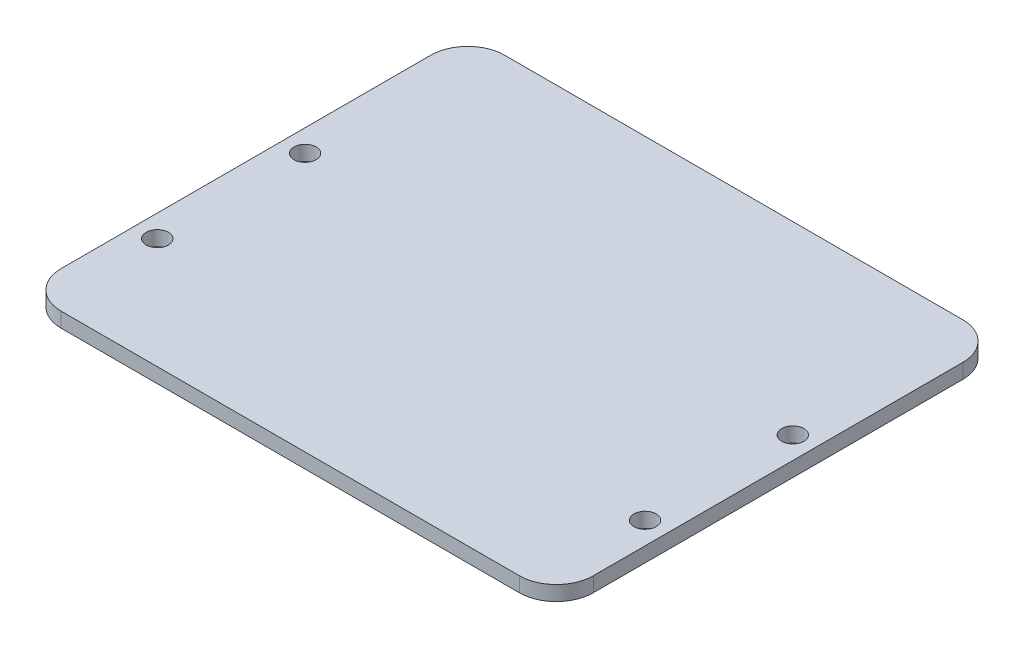
ISO-10303-21;
HEADER;
FILE_DESCRIPTION(('STEP AP214'),'2;1');
FILE_NAME('part.step','',(''),(''),'','','');
FILE_SCHEMA(('AUTOMOTIVE_DESIGN { 1 0 10303 214 1 1 1 1 }'));
ENDSEC;
DATA;
#1=APPLICATION_CONTEXT('core data for automotive mechanical design processes');
#2=APPLICATION_PROTOCOL_DEFINITION('international standard','automotive_design',2000,#1);
#3=PRODUCT_CONTEXT('',#1,'mechanical');
#4=PRODUCT('Part','Part','',(#3));
#5=PRODUCT_RELATED_PRODUCT_CATEGORY('part','',(#4));
#6=PRODUCT_DEFINITION_FORMATION('','',#4);
#7=PRODUCT_DEFINITION_CONTEXT('part definition',#1,'design');
#8=PRODUCT_DEFINITION('design','',#6,#7);
#9=PRODUCT_DEFINITION_SHAPE('','',#8);
#10=(LENGTH_UNIT() NAMED_UNIT(*) SI_UNIT(.MILLI.,.METRE.));
#11=(NAMED_UNIT(*) PLANE_ANGLE_UNIT() SI_UNIT($,.RADIAN.));
#12=(NAMED_UNIT(*) SI_UNIT($,.STERADIAN.) SOLID_ANGLE_UNIT());
#13=UNCERTAINTY_MEASURE_WITH_UNIT(LENGTH_MEASURE(1.E-05),#10,'distance_accuracy_value','');
#14=(GEOMETRIC_REPRESENTATION_CONTEXT(3) GLOBAL_UNCERTAINTY_ASSIGNED_CONTEXT((#13)) GLOBAL_UNIT_ASSIGNED_CONTEXT((#10,
#11,#12)) REPRESENTATION_CONTEXT('',''));
#15=CARTESIAN_POINT('',(0.,0.,0.));
#16=DIRECTION('',(0.,0.,1.));
#17=DIRECTION('',(1.,0.,0.));
#18=AXIS2_PLACEMENT_3D('',#15,#16,#17);
#19=CARTESIAN_POINT('',(0.,2.,0.));
#20=DIRECTION('',(0.,1.,0.));
#21=DIRECTION('',(0.,0.,1.));
#22=AXIS2_PLACEMENT_3D('',#19,#20,#21);
#23=PLANE('',#22);
#24=CARTESIAN_POINT('',(33.,2.,15.));
#25=DIRECTION('',(0.,1.,0.));
#26=DIRECTION('',(0.,0.,-1.));
#27=AXIS2_PLACEMENT_3D('',#24,#25,#26);
#28=CIRCLE('',#27,1.5);
#29=CARTESIAN_POINT('',(33.,2.,13.5));
#30=VERTEX_POINT('',#29);
#31=EDGE_CURVE('E193',#30,#30,#28,.T.);
#32=ORIENTED_EDGE('',*,*,#31,.F.);
#33=EDGE_LOOP('',(#32));
#34=FACE_BOUND('',#33,.T.);
#35=CARTESIAN_POINT('',(-33.,2.,-5.));
#36=DIRECTION('',(0.,1.,0.));
#37=DIRECTION('',(0.,0.,1.));
#38=AXIS2_PLACEMENT_3D('',#35,#36,#37);
#39=CIRCLE('',#38,1.5);
#40=CARTESIAN_POINT('',(-33.,2.,-3.5));
#41=VERTEX_POINT('',#40);
#42=EDGE_CURVE('E136',#41,#41,#39,.T.);
#43=ORIENTED_EDGE('',*,*,#42,.F.);
#44=EDGE_LOOP('',(#43));
#45=FACE_BOUND('',#44,.T.);
#46=DIRECTION('',(1.,0.,0.));
#47=VECTOR('',#46,1.);
#48=CARTESIAN_POINT('',(-36.,2.,30.));
#49=LINE('',#48,#47);
#50=CARTESIAN_POINT('',(-31.,2.,30.));
#51=VERTEX_POINT('',#50);
#52=CARTESIAN_POINT('',(31.,2.,30.));
#53=VERTEX_POINT('',#52);
#54=EDGE_CURVE('E144',#51,#53,#49,.T.);
#55=ORIENTED_EDGE('',*,*,#54,.T.);
#56=CARTESIAN_POINT('',(31.,2.,25.));
#57=DIRECTION('',(0.,1.,0.));
#58=DIRECTION('',(0.,0.,1.));
#59=AXIS2_PLACEMENT_3D('',#56,#57,#58);
#60=CIRCLE('',#59,5.);
#61=CARTESIAN_POINT('',(36.,2.,25.));
#62=VERTEX_POINT('',#61);
#63=EDGE_CURVE('E162',#53,#62,#60,.T.);
#64=ORIENTED_EDGE('',*,*,#63,.T.);
#65=DIRECTION('',(0.,0.,-1.));
#66=VECTOR('',#65,1.);
#67=CARTESIAN_POINT('',(36.,2.,-30.));
#68=LINE('',#67,#66);
#69=CARTESIAN_POINT('',(36.,2.,-25.));
#70=VERTEX_POINT('',#69);
#71=EDGE_CURVE('E130',#62,#70,#68,.T.);
#72=ORIENTED_EDGE('',*,*,#71,.T.);
#73=CARTESIAN_POINT('',(31.,2.,-25.));
#74=DIRECTION('',(0.,1.,0.));
#75=DIRECTION('',(0.,0.,1.));
#76=AXIS2_PLACEMENT_3D('',#73,#74,#75);
#77=CIRCLE('',#76,5.);
#78=CARTESIAN_POINT('',(31.,2.,-30.));
#79=VERTEX_POINT('',#78);
#80=EDGE_CURVE('E159',#70,#79,#77,.T.);
#81=ORIENTED_EDGE('',*,*,#80,.T.);
#82=DIRECTION('',(-1.,0.,0.));
#83=VECTOR('',#82,1.);
#84=CARTESIAN_POINT('',(-36.,2.,-30.));
#85=LINE('',#84,#83);
#86=CARTESIAN_POINT('',(-31.,2.,-30.));
#87=VERTEX_POINT('',#86);
#88=EDGE_CURVE('E173',#79,#87,#85,.T.);
#89=ORIENTED_EDGE('',*,*,#88,.T.);
#90=CARTESIAN_POINT('',(-31.,2.,-25.));
#91=DIRECTION('',(0.,1.,0.));
#92=DIRECTION('',(0.,0.,1.));
#93=AXIS2_PLACEMENT_3D('',#90,#91,#92);
#94=CIRCLE('',#93,5.);
#95=CARTESIAN_POINT('',(-36.,2.,-25.));
#96=VERTEX_POINT('',#95);
#97=EDGE_CURVE('E64',#87,#96,#94,.T.);
#98=ORIENTED_EDGE('',*,*,#97,.T.);
#99=DIRECTION('',(0.,0.,1.));
#100=VECTOR('',#99,1.);
#101=CARTESIAN_POINT('',(-36.,2.,-30.));
#102=LINE('',#101,#100);
#103=CARTESIAN_POINT('',(-36.,2.,25.));
#104=VERTEX_POINT('',#103);
#105=EDGE_CURVE('E185',#96,#104,#102,.T.);
#106=ORIENTED_EDGE('',*,*,#105,.T.);
#107=CARTESIAN_POINT('',(-31.,2.,25.));
#108=DIRECTION('',(0.,1.,0.));
#109=DIRECTION('',(0.,0.,1.));
#110=AXIS2_PLACEMENT_3D('',#107,#108,#109);
#111=CIRCLE('',#110,5.);
#112=EDGE_CURVE('E158',#104,#51,#111,.T.);
#113=ORIENTED_EDGE('',*,*,#112,.T.);
#114=EDGE_LOOP('',(#55,#64,#72,#81,#89,#98,#106,#113));
#115=FACE_BOUND('',#114,.T.);
#116=CARTESIAN_POINT('',(-33.,2.,15.));
#117=DIRECTION('',(0.,1.,0.));
#118=DIRECTION('',(0.,0.,1.));
#119=AXIS2_PLACEMENT_3D('',#116,#117,#118);
#120=CIRCLE('',#119,1.5);
#121=CARTESIAN_POINT('',(-33.,2.,16.5));
#122=VERTEX_POINT('',#121);
#123=EDGE_CURVE('E188',#122,#122,#120,.T.);
#124=ORIENTED_EDGE('',*,*,#123,.F.);
#125=EDGE_LOOP('',(#124));
#126=FACE_BOUND('',#125,.T.);
#127=CARTESIAN_POINT('',(33.,2.,-5.00000000000001));
#128=DIRECTION('',(0.,1.,0.));
#129=DIRECTION('',(0.,0.,-1.));
#130=AXIS2_PLACEMENT_3D('',#127,#128,#129);
#131=CIRCLE('',#130,1.5);
#132=CARTESIAN_POINT('',(33.,2.,-6.50000000000001));
#133=VERTEX_POINT('',#132);
#134=EDGE_CURVE('E199',#133,#133,#131,.T.);
#135=ORIENTED_EDGE('',*,*,#134,.F.);
#136=EDGE_LOOP('',(#135));
#137=FACE_BOUND('',#136,.T.);
#138=ADVANCED_FACE('F41',(#34,#45,#115,#126,#137),#23,.T.);
#139=CARTESIAN_POINT('',(0.,0.,0.));
#140=DIRECTION('',(0.,1.,0.));
#141=DIRECTION('',(0.,0.,1.));
#142=AXIS2_PLACEMENT_3D('',#139,#140,#141);
#143=PLANE('',#142);
#144=DIRECTION('',(0.,0.,-1.));
#145=VECTOR('',#144,1.);
#146=CARTESIAN_POINT('',(36.,0.,-30.));
#147=LINE('',#146,#145);
#148=CARTESIAN_POINT('',(36.,0.,25.));
#149=VERTEX_POINT('',#148);
#150=CARTESIAN_POINT('',(36.,0.,-25.));
#151=VERTEX_POINT('',#150);
#152=EDGE_CURVE('E123',#149,#151,#147,.T.);
#153=ORIENTED_EDGE('',*,*,#152,.F.);
#154=CARTESIAN_POINT('',(31.,0.,25.));
#155=DIRECTION('',(0.,1.,0.));
#156=DIRECTION('',(0.,0.,1.));
#157=AXIS2_PLACEMENT_3D('',#154,#155,#156);
#158=CIRCLE('',#157,5.);
#159=CARTESIAN_POINT('',(31.,0.,30.));
#160=VERTEX_POINT('',#159);
#161=EDGE_CURVE('E110',#149,#160,#158,.F.);
#162=ORIENTED_EDGE('',*,*,#161,.T.);
#163=DIRECTION('',(1.,0.,0.));
#164=VECTOR('',#163,1.);
#165=CARTESIAN_POINT('',(-36.,0.,30.));
#166=LINE('',#165,#164);
#167=CARTESIAN_POINT('',(-31.,0.,30.));
#168=VERTEX_POINT('',#167);
#169=EDGE_CURVE('E149',#168,#160,#166,.T.);
#170=ORIENTED_EDGE('',*,*,#169,.F.);
#171=CARTESIAN_POINT('',(-31.,0.,25.));
#172=DIRECTION('',(0.,1.,0.));
#173=DIRECTION('',(0.,0.,1.));
#174=AXIS2_PLACEMENT_3D('',#171,#172,#173);
#175=CIRCLE('',#174,5.);
#176=CARTESIAN_POINT('',(-36.,0.,25.));
#177=VERTEX_POINT('',#176);
#178=EDGE_CURVE('E126',#168,#177,#175,.F.);
#179=ORIENTED_EDGE('',*,*,#178,.T.);
#180=DIRECTION('',(0.,0.,1.));
#181=VECTOR('',#180,1.);
#182=CARTESIAN_POINT('',(-36.,0.,-30.));
#183=LINE('',#182,#181);
#184=CARTESIAN_POINT('',(-36.,0.,-25.));
#185=VERTEX_POINT('',#184);
#186=EDGE_CURVE('E138',#185,#177,#183,.T.);
#187=ORIENTED_EDGE('',*,*,#186,.F.);
#188=CARTESIAN_POINT('',(-31.,0.,-25.));
#189=DIRECTION('',(0.,1.,0.));
#190=DIRECTION('',(0.,0.,1.));
#191=AXIS2_PLACEMENT_3D('',#188,#189,#190);
#192=CIRCLE('',#191,5.);
#193=CARTESIAN_POINT('',(-31.,0.,-30.));
#194=VERTEX_POINT('',#193);
#195=EDGE_CURVE('E119',#185,#194,#192,.F.);
#196=ORIENTED_EDGE('',*,*,#195,.T.);
#197=DIRECTION('',(-1.,0.,0.));
#198=VECTOR('',#197,1.);
#199=CARTESIAN_POINT('',(-36.,0.,-30.));
#200=LINE('',#199,#198);
#201=CARTESIAN_POINT('',(31.,0.,-30.));
#202=VERTEX_POINT('',#201);
#203=EDGE_CURVE('E135',#202,#194,#200,.T.);
#204=ORIENTED_EDGE('',*,*,#203,.F.);
#205=CARTESIAN_POINT('',(31.,0.,-25.));
#206=DIRECTION('',(0.,1.,0.));
#207=DIRECTION('',(0.,0.,1.));
#208=AXIS2_PLACEMENT_3D('',#205,#206,#207);
#209=CIRCLE('',#208,5.);
#210=EDGE_CURVE('E133',#202,#151,#209,.F.);
#211=ORIENTED_EDGE('',*,*,#210,.T.);
#212=EDGE_LOOP('',(#153,#162,#170,#179,#187,#196,#204,#211));
#213=FACE_BOUND('',#212,.T.);
#214=CARTESIAN_POINT('',(-33.,0.,-5.));
#215=DIRECTION('',(0.,1.,0.));
#216=DIRECTION('',(0.,0.,1.));
#217=AXIS2_PLACEMENT_3D('',#214,#215,#216);
#218=CIRCLE('',#217,1.5);
#219=CARTESIAN_POINT('',(-33.,0.,-3.5));
#220=VERTEX_POINT('',#219);
#221=EDGE_CURVE('E142',#220,#220,#218,.T.);
#222=ORIENTED_EDGE('',*,*,#221,.T.);
#223=EDGE_LOOP('',(#222));
#224=FACE_BOUND('',#223,.T.);
#225=CARTESIAN_POINT('',(-33.,0.,15.));
#226=DIRECTION('',(0.,1.,0.));
#227=DIRECTION('',(0.,0.,1.));
#228=AXIS2_PLACEMENT_3D('',#225,#226,#227);
#229=CIRCLE('',#228,1.5);
#230=CARTESIAN_POINT('',(-33.,0.,16.5));
#231=VERTEX_POINT('',#230);
#232=EDGE_CURVE('E191',#231,#231,#229,.T.);
#233=ORIENTED_EDGE('',*,*,#232,.T.);
#234=EDGE_LOOP('',(#233));
#235=FACE_BOUND('',#234,.T.);
#236=CARTESIAN_POINT('',(33.,0.,15.));
#237=DIRECTION('',(0.,1.,0.));
#238=DIRECTION('',(0.,0.,-1.));
#239=AXIS2_PLACEMENT_3D('',#236,#237,#238);
#240=CIRCLE('',#239,1.5);
#241=CARTESIAN_POINT('',(33.,0.,13.5));
#242=VERTEX_POINT('',#241);
#243=EDGE_CURVE('E197',#242,#242,#240,.T.);
#244=ORIENTED_EDGE('',*,*,#243,.T.);
#245=EDGE_LOOP('',(#244));
#246=FACE_BOUND('',#245,.T.);
#247=CARTESIAN_POINT('',(33.,0.,-5.00000000000001));
#248=DIRECTION('',(0.,1.,0.));
#249=DIRECTION('',(0.,0.,-1.));
#250=AXIS2_PLACEMENT_3D('',#247,#248,#249);
#251=CIRCLE('',#250,1.5);
#252=CARTESIAN_POINT('',(33.,0.,-6.50000000000001));
#253=VERTEX_POINT('',#252);
#254=EDGE_CURVE('E201',#253,#253,#251,.T.);
#255=ORIENTED_EDGE('',*,*,#254,.T.);
#256=EDGE_LOOP('',(#255));
#257=FACE_BOUND('',#256,.T.);
#258=ADVANCED_FACE('F131',(#213,#224,#235,#246,#257),#143,.F.);
#259=CARTESIAN_POINT('',(36.,2.,-30.));
#260=DIRECTION('',(-1.,0.,0.));
#261=DIRECTION('',(0.,0.,1.));
#262=AXIS2_PLACEMENT_3D('',#259,#260,#261);
#263=PLANE('',#262);
#264=ORIENTED_EDGE('',*,*,#71,.F.);
#265=DIRECTION('',(0.,-1.,0.));
#266=VECTOR('',#265,1.);
#267=CARTESIAN_POINT('',(36.,2.,25.));
#268=LINE('',#267,#266);
#269=EDGE_CURVE('E112',#62,#149,#268,.T.);
#270=ORIENTED_EDGE('',*,*,#269,.T.);
#271=ORIENTED_EDGE('',*,*,#152,.T.);
#272=DIRECTION('',(0.,-1.,0.));
#273=VECTOR('',#272,1.);
#274=CARTESIAN_POINT('',(36.,2.,-25.));
#275=LINE('',#274,#273);
#276=EDGE_CURVE('E129',#151,#70,#275,.F.);
#277=ORIENTED_EDGE('',*,*,#276,.T.);
#278=EDGE_LOOP('',(#264,#270,#271,#277));
#279=FACE_BOUND('',#278,.T.);
#280=ADVANCED_FACE('F124',(#279),#263,.F.);
#281=CARTESIAN_POINT('',(-36.,2.,-30.));
#282=DIRECTION('',(0.,0.,1.));
#283=DIRECTION('',(1.,0.,0.));
#284=AXIS2_PLACEMENT_3D('',#281,#282,#283);
#285=PLANE('',#284);
#286=ORIENTED_EDGE('',*,*,#203,.T.);
#287=DIRECTION('',(0.,-1.,0.));
#288=VECTOR('',#287,1.);
#289=CARTESIAN_POINT('',(-31.,2.,-30.));
#290=LINE('',#289,#288);
#291=EDGE_CURVE('E11',#194,#87,#290,.F.);
#292=ORIENTED_EDGE('',*,*,#291,.T.);
#293=ORIENTED_EDGE('',*,*,#88,.F.);
#294=DIRECTION('',(0.,-1.,0.));
#295=VECTOR('',#294,1.);
#296=CARTESIAN_POINT('',(31.,2.,-30.));
#297=LINE('',#296,#295);
#298=EDGE_CURVE('E47',#79,#202,#297,.T.);
#299=ORIENTED_EDGE('',*,*,#298,.T.);
#300=EDGE_LOOP('',(#286,#292,#293,#299));
#301=FACE_BOUND('',#300,.T.);
#302=ADVANCED_FACE('F172',(#301),#285,.F.);
#303=CARTESIAN_POINT('',(-36.,2.,-30.));
#304=DIRECTION('',(1.,0.,0.));
#305=DIRECTION('',(0.,0.,-1.));
#306=AXIS2_PLACEMENT_3D('',#303,#304,#305);
#307=PLANE('',#306);
#308=ORIENTED_EDGE('',*,*,#105,.F.);
#309=DIRECTION('',(0.,-1.,0.));
#310=VECTOR('',#309,1.);
#311=CARTESIAN_POINT('',(-36.,2.,-25.));
#312=LINE('',#311,#310);
#313=EDGE_CURVE('E167',#96,#185,#312,.T.);
#314=ORIENTED_EDGE('',*,*,#313,.T.);
#315=ORIENTED_EDGE('',*,*,#186,.T.);
#316=DIRECTION('',(0.,-1.,0.));
#317=VECTOR('',#316,1.);
#318=CARTESIAN_POINT('',(-36.,2.,25.));
#319=LINE('',#318,#317);
#320=EDGE_CURVE('E57',#177,#104,#319,.F.);
#321=ORIENTED_EDGE('',*,*,#320,.T.);
#322=EDGE_LOOP('',(#308,#314,#315,#321));
#323=FACE_BOUND('',#322,.T.);
#324=ADVANCED_FACE('F182',(#323),#307,.F.);
#325=CARTESIAN_POINT('',(-36.,2.,30.));
#326=DIRECTION('',(0.,0.,-1.));
#327=DIRECTION('',(-1.,0.,0.));
#328=AXIS2_PLACEMENT_3D('',#325,#326,#327);
#329=PLANE('',#328);
#330=ORIENTED_EDGE('',*,*,#169,.T.);
#331=DIRECTION('',(0.,-1.,0.));
#332=VECTOR('',#331,1.);
#333=CARTESIAN_POINT('',(31.,2.,30.));
#334=LINE('',#333,#332);
#335=EDGE_CURVE('E115',#160,#53,#334,.F.);
#336=ORIENTED_EDGE('',*,*,#335,.T.);
#337=ORIENTED_EDGE('',*,*,#54,.F.);
#338=DIRECTION('',(0.,-1.,0.));
#339=VECTOR('',#338,1.);
#340=CARTESIAN_POINT('',(-31.,2.,30.));
#341=LINE('',#340,#339);
#342=EDGE_CURVE('E117',#51,#168,#341,.T.);
#343=ORIENTED_EDGE('',*,*,#342,.T.);
#344=EDGE_LOOP('',(#330,#336,#337,#343));
#345=FACE_BOUND('',#344,.T.);
#346=ADVANCED_FACE('F226',(#345),#329,.F.);
#347=CARTESIAN_POINT('',(-33.,2.,-5.));
#348=DIRECTION('',(0.,-1.,0.));
#349=DIRECTION('',(0.,0.,-1.));
#350=AXIS2_PLACEMENT_3D('',#347,#348,#349);
#351=CYLINDRICAL_SURFACE('',#350,1.5);
#352=ORIENTED_EDGE('',*,*,#42,.T.);
#353=EDGE_LOOP('',(#352));
#354=FACE_BOUND('',#353,.T.);
#355=ORIENTED_EDGE('',*,*,#221,.F.);
#356=EDGE_LOOP('',(#355));
#357=FACE_BOUND('',#356,.T.);
#358=ADVANCED_FACE('F224',(#354,#357),#351,.F.);
#359=CARTESIAN_POINT('',(-33.,2.,15.));
#360=DIRECTION('',(0.,-1.,0.));
#361=DIRECTION('',(0.,0.,-1.));
#362=AXIS2_PLACEMENT_3D('',#359,#360,#361);
#363=CYLINDRICAL_SURFACE('',#362,1.5);
#364=ORIENTED_EDGE('',*,*,#123,.T.);
#365=EDGE_LOOP('',(#364));
#366=FACE_BOUND('',#365,.T.);
#367=ORIENTED_EDGE('',*,*,#232,.F.);
#368=EDGE_LOOP('',(#367));
#369=FACE_BOUND('',#368,.T.);
#370=ADVANCED_FACE('F250',(#366,#369),#363,.F.);
#371=CARTESIAN_POINT('',(33.,2.,15.));
#372=DIRECTION('',(0.,-1.,0.));
#373=DIRECTION('',(0.,0.,-1.));
#374=AXIS2_PLACEMENT_3D('',#371,#372,#373);
#375=CYLINDRICAL_SURFACE('',#374,1.5);
#376=ORIENTED_EDGE('',*,*,#31,.T.);
#377=EDGE_LOOP('',(#376));
#378=FACE_BOUND('',#377,.T.);
#379=ORIENTED_EDGE('',*,*,#243,.F.);
#380=EDGE_LOOP('',(#379));
#381=FACE_BOUND('',#380,.T.);
#382=ADVANCED_FACE('F251',(#378,#381),#375,.F.);
#383=CARTESIAN_POINT('',(33.,2.,-5.00000000000001));
#384=DIRECTION('',(0.,-1.,0.));
#385=DIRECTION('',(0.,0.,-1.));
#386=AXIS2_PLACEMENT_3D('',#383,#384,#385);
#387=CYLINDRICAL_SURFACE('',#386,1.5);
#388=ORIENTED_EDGE('',*,*,#134,.T.);
#389=EDGE_LOOP('',(#388));
#390=FACE_BOUND('',#389,.T.);
#391=ORIENTED_EDGE('',*,*,#254,.F.);
#392=EDGE_LOOP('',(#391));
#393=FACE_BOUND('',#392,.T.);
#394=ADVANCED_FACE('F207',(#390,#393),#387,.F.);
#395=CARTESIAN_POINT('',(31.,2.,25.));
#396=DIRECTION('',(0.,-1.,0.));
#397=DIRECTION('',(0.,0.,-1.));
#398=AXIS2_PLACEMENT_3D('',#395,#396,#397);
#399=CYLINDRICAL_SURFACE('',#398,5.);
#400=ORIENTED_EDGE('',*,*,#63,.F.);
#401=ORIENTED_EDGE('',*,*,#335,.F.);
#402=ORIENTED_EDGE('',*,*,#161,.F.);
#403=ORIENTED_EDGE('',*,*,#269,.F.);
#404=EDGE_LOOP('',(#400,#401,#402,#403));
#405=FACE_BOUND('',#404,.T.);
#406=ADVANCED_FACE('F109',(#405),#399,.T.);
#407=CARTESIAN_POINT('',(-31.,2.,-25.));
#408=DIRECTION('',(0.,-1.,0.));
#409=DIRECTION('',(0.,0.,-1.));
#410=AXIS2_PLACEMENT_3D('',#407,#408,#409);
#411=CYLINDRICAL_SURFACE('',#410,5.);
#412=ORIENTED_EDGE('',*,*,#97,.F.);
#413=ORIENTED_EDGE('',*,*,#291,.F.);
#414=ORIENTED_EDGE('',*,*,#195,.F.);
#415=ORIENTED_EDGE('',*,*,#313,.F.);
#416=EDGE_LOOP('',(#412,#413,#414,#415));
#417=FACE_BOUND('',#416,.T.);
#418=ADVANCED_FACE('F180',(#417),#411,.T.);
#419=CARTESIAN_POINT('',(31.,2.,-25.));
#420=DIRECTION('',(0.,-1.,0.));
#421=DIRECTION('',(0.,0.,-1.));
#422=AXIS2_PLACEMENT_3D('',#419,#420,#421);
#423=CYLINDRICAL_SURFACE('',#422,5.);
#424=ORIENTED_EDGE('',*,*,#80,.F.);
#425=ORIENTED_EDGE('',*,*,#276,.F.);
#426=ORIENTED_EDGE('',*,*,#210,.F.);
#427=ORIENTED_EDGE('',*,*,#298,.F.);
#428=EDGE_LOOP('',(#424,#425,#426,#427));
#429=FACE_BOUND('',#428,.T.);
#430=ADVANCED_FACE('F239',(#429),#423,.T.);
#431=CARTESIAN_POINT('',(-31.,2.,25.));
#432=DIRECTION('',(0.,-1.,0.));
#433=DIRECTION('',(0.,0.,-1.));
#434=AXIS2_PLACEMENT_3D('',#431,#432,#433);
#435=CYLINDRICAL_SURFACE('',#434,5.);
#436=ORIENTED_EDGE('',*,*,#112,.F.);
#437=ORIENTED_EDGE('',*,*,#320,.F.);
#438=ORIENTED_EDGE('',*,*,#178,.F.);
#439=ORIENTED_EDGE('',*,*,#342,.F.);
#440=EDGE_LOOP('',(#436,#437,#438,#439));
#441=FACE_BOUND('',#440,.T.);
#442=ADVANCED_FACE('F43',(#441),#435,.T.);
#443=CLOSED_SHELL('',(#138,#258,#280,#302,#324,#346,#358,#370,#382,#394,#406,#418,#430,#442));
#444=MANIFOLD_SOLID_BREP('B2',#443);
#445=ADVANCED_BREP_SHAPE_REPRESENTATION('',(#18,#444),#14);
#446=SHAPE_DEFINITION_REPRESENTATION(#9,#445);
ENDSEC;
END-ISO-10303-21;
